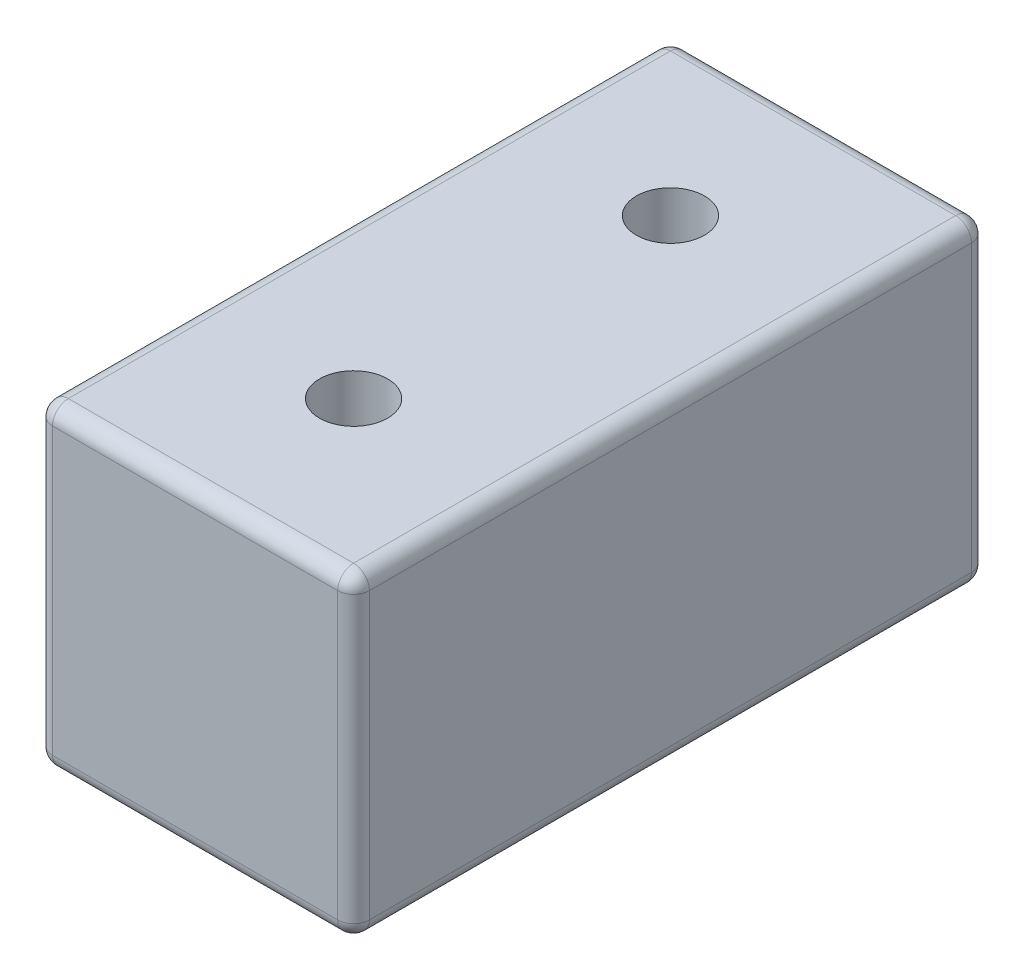
ISO-10303-21;
HEADER;
FILE_DESCRIPTION(('STEP AP214'),'2;1');
FILE_NAME('part.step','',(''),(''),'','','');
FILE_SCHEMA(('AUTOMOTIVE_DESIGN { 1 0 10303 214 1 1 1 1 }'));
ENDSEC;
DATA;
#1=APPLICATION_CONTEXT('core data for automotive mechanical design processes');
#2=APPLICATION_PROTOCOL_DEFINITION('international standard','automotive_design',2000,#1);
#3=PRODUCT_CONTEXT('',#1,'mechanical');
#4=PRODUCT('Part','Part','',(#3));
#5=PRODUCT_RELATED_PRODUCT_CATEGORY('part','',(#4));
#6=PRODUCT_DEFINITION_FORMATION('','',#4);
#7=PRODUCT_DEFINITION_CONTEXT('part definition',#1,'design');
#8=PRODUCT_DEFINITION('design','',#6,#7);
#9=PRODUCT_DEFINITION_SHAPE('','',#8);
#10=(LENGTH_UNIT() NAMED_UNIT(*) SI_UNIT(.MILLI.,.METRE.));
#11=(NAMED_UNIT(*) PLANE_ANGLE_UNIT() SI_UNIT($,.RADIAN.));
#12=(NAMED_UNIT(*) SI_UNIT($,.STERADIAN.) SOLID_ANGLE_UNIT());
#13=UNCERTAINTY_MEASURE_WITH_UNIT(LENGTH_MEASURE(1.E-05),#10,'distance_accuracy_value','');
#14=(GEOMETRIC_REPRESENTATION_CONTEXT(3) GLOBAL_UNCERTAINTY_ASSIGNED_CONTEXT((#13)) GLOBAL_UNIT_ASSIGNED_CONTEXT((#10,
#11,#12)) REPRESENTATION_CONTEXT('',''));
#15=CARTESIAN_POINT('',(0.,0.,0.));
#16=DIRECTION('',(0.,0.,1.));
#17=DIRECTION('',(1.,0.,0.));
#18=AXIS2_PLACEMENT_3D('',#15,#16,#17);
#19=CARTESIAN_POINT('',(0.,0.,40.));
#20=DIRECTION('',(1.,0.,0.));
#21=DIRECTION('',(0.,0.,-1.));
#22=AXIS2_PLACEMENT_3D('',#19,#20,#21);
#23=PLANE('',#22);
#24=DIRECTION('',(0.,-1.,0.));
#25=VECTOR('',#24,1.);
#26=CARTESIAN_POINT('',(0.,0.,39.));
#27=LINE('',#26,#25);
#28=CARTESIAN_POINT('',(0.,1.,39.));
#29=VERTEX_POINT('',#28);
#30=CARTESIAN_POINT('',(0.,19.,39.));
#31=VERTEX_POINT('',#30);
#32=EDGE_CURVE('E167',#29,#31,#27,.F.);
#33=ORIENTED_EDGE('',*,*,#32,.T.);
#34=DIRECTION('',(0.,0.,-1.));
#35=VECTOR('',#34,1.);
#36=CARTESIAN_POINT('',(0.,19.,40.));
#37=LINE('',#36,#35);
#38=CARTESIAN_POINT('',(0.,19.,1.));
#39=VERTEX_POINT('',#38);
#40=EDGE_CURVE('E171',#31,#39,#37,.T.);
#41=ORIENTED_EDGE('',*,*,#40,.T.);
#42=DIRECTION('',(0.,-1.,0.));
#43=VECTOR('',#42,1.);
#44=CARTESIAN_POINT('',(0.,0.,1.));
#45=LINE('',#44,#43);
#46=CARTESIAN_POINT('',(0.,1.,1.));
#47=VERTEX_POINT('',#46);
#48=EDGE_CURVE('E144',#39,#47,#45,.T.);
#49=ORIENTED_EDGE('',*,*,#48,.T.);
#50=DIRECTION('',(0.,0.,-1.));
#51=VECTOR('',#50,1.);
#52=CARTESIAN_POINT('',(0.,1.,40.));
#53=LINE('',#52,#51);
#54=EDGE_CURVE('E162',#47,#29,#53,.F.);
#55=ORIENTED_EDGE('',*,*,#54,.T.);
#56=EDGE_LOOP('',(#33,#41,#49,#55));
#57=FACE_BOUND('',#56,.T.);
#58=ADVANCED_FACE('F47',(#57),#23,.F.);
#59=CARTESIAN_POINT('',(0.,0.,40.));
#60=DIRECTION('',(0.,1.,0.));
#61=DIRECTION('',(0.,0.,1.));
#62=AXIS2_PLACEMENT_3D('',#59,#60,#61);
#63=PLANE('',#62);
#64=DIRECTION('',(1.,0.,0.));
#65=VECTOR('',#64,1.);
#66=CARTESIAN_POINT('',(20.,0.,1.));
#67=LINE('',#66,#65);
#68=CARTESIAN_POINT('',(1.,0.,1.));
#69=VERTEX_POINT('',#68);
#70=CARTESIAN_POINT('',(19.,0.,1.));
#71=VERTEX_POINT('',#70);
#72=EDGE_CURVE('E188',#69,#71,#67,.T.);
#73=ORIENTED_EDGE('',*,*,#72,.T.);
#74=DIRECTION('',(0.,0.,-1.));
#75=VECTOR('',#74,1.);
#76=CARTESIAN_POINT('',(19.,0.,40.));
#77=LINE('',#76,#75);
#78=CARTESIAN_POINT('',(19.,0.,39.));
#79=VERTEX_POINT('',#78);
#80=EDGE_CURVE('E191',#71,#79,#77,.F.);
#81=ORIENTED_EDGE('',*,*,#80,.T.);
#82=DIRECTION('',(1.,0.,0.));
#83=VECTOR('',#82,1.);
#84=CARTESIAN_POINT('',(0.,0.,39.));
#85=LINE('',#84,#83);
#86=CARTESIAN_POINT('',(1.,0.,39.));
#87=VERTEX_POINT('',#86);
#88=EDGE_CURVE('E186',#79,#87,#85,.F.);
#89=ORIENTED_EDGE('',*,*,#88,.T.);
#90=DIRECTION('',(0.,0.,-1.));
#91=VECTOR('',#90,1.);
#92=CARTESIAN_POINT('',(1.,0.,40.));
#93=LINE('',#92,#91);
#94=EDGE_CURVE('E184',#87,#69,#93,.T.);
#95=ORIENTED_EDGE('',*,*,#94,.T.);
#96=EDGE_LOOP('',(#73,#81,#89,#95));
#97=FACE_BOUND('',#96,.T.);
#98=CARTESIAN_POINT('',(10.,0.,30.));
#99=DIRECTION('',(0.,1.,0.));
#100=DIRECTION('',(0.,0.,1.));
#101=AXIS2_PLACEMENT_3D('',#98,#99,#100);
#102=CIRCLE('',#101,2.15);
#103=CARTESIAN_POINT('',(10.,0.,32.15));
#104=VERTEX_POINT('',#103);
#105=EDGE_CURVE('E168',#104,#104,#102,.T.);
#106=ORIENTED_EDGE('',*,*,#105,.T.);
#107=EDGE_LOOP('',(#106));
#108=FACE_BOUND('',#107,.T.);
#109=CARTESIAN_POINT('',(10.,0.,9.99999999999999));
#110=DIRECTION('',(0.,1.,0.));
#111=DIRECTION('',(0.,0.,1.));
#112=AXIS2_PLACEMENT_3D('',#109,#110,#111);
#113=CIRCLE('',#112,2.15);
#114=CARTESIAN_POINT('',(10.,0.,12.15));
#115=VERTEX_POINT('',#114);
#116=EDGE_CURVE('E280',#115,#115,#113,.T.);
#117=ORIENTED_EDGE('',*,*,#116,.T.);
#118=EDGE_LOOP('',(#117));
#119=FACE_BOUND('',#118,.T.);
#120=ADVANCED_FACE('F288',(#97,#108,#119),#63,.F.);
#121=CARTESIAN_POINT('',(20.,0.,40.));
#122=DIRECTION('',(-1.,0.,0.));
#123=DIRECTION('',(0.,0.,1.));
#124=AXIS2_PLACEMENT_3D('',#121,#122,#123);
#125=PLANE('',#124);
#126=DIRECTION('',(0.,1.,0.));
#127=VECTOR('',#126,1.);
#128=CARTESIAN_POINT('',(20.,20.,1.));
#129=LINE('',#128,#127);
#130=CARTESIAN_POINT('',(20.,1.,1.));
#131=VERTEX_POINT('',#130);
#132=CARTESIAN_POINT('',(20.,19.,1.));
#133=VERTEX_POINT('',#132);
#134=EDGE_CURVE('E197',#131,#133,#129,.T.);
#135=ORIENTED_EDGE('',*,*,#134,.T.);
#136=DIRECTION('',(0.,0.,-1.));
#137=VECTOR('',#136,1.);
#138=CARTESIAN_POINT('',(20.,19.,40.));
#139=LINE('',#138,#137);
#140=CARTESIAN_POINT('',(20.,19.,39.));
#141=VERTEX_POINT('',#140);
#142=EDGE_CURVE('E200',#133,#141,#139,.F.);
#143=ORIENTED_EDGE('',*,*,#142,.T.);
#144=DIRECTION('',(0.,1.,0.));
#145=VECTOR('',#144,1.);
#146=CARTESIAN_POINT('',(20.,0.,39.));
#147=LINE('',#146,#145);
#148=CARTESIAN_POINT('',(20.,1.,39.));
#149=VERTEX_POINT('',#148);
#150=EDGE_CURVE('E195',#141,#149,#147,.F.);
#151=ORIENTED_EDGE('',*,*,#150,.T.);
#152=DIRECTION('',(0.,0.,-1.));
#153=VECTOR('',#152,1.);
#154=CARTESIAN_POINT('',(20.,1.,40.));
#155=LINE('',#154,#153);
#156=EDGE_CURVE('E193',#149,#131,#155,.T.);
#157=ORIENTED_EDGE('',*,*,#156,.T.);
#158=EDGE_LOOP('',(#135,#143,#151,#157));
#159=FACE_BOUND('',#158,.T.);
#160=ADVANCED_FACE('F309',(#159),#125,.F.);
#161=CARTESIAN_POINT('',(0.,20.,40.));
#162=DIRECTION('',(0.,-1.,0.));
#163=DIRECTION('',(0.,0.,-1.));
#164=AXIS2_PLACEMENT_3D('',#161,#162,#163);
#165=PLANE('',#164);
#166=DIRECTION('',(0.,0.,-1.));
#167=VECTOR('',#166,1.);
#168=CARTESIAN_POINT('',(19.,20.,40.));
#169=LINE('',#168,#167);
#170=CARTESIAN_POINT('',(19.,20.,39.));
#171=VERTEX_POINT('',#170);
#172=CARTESIAN_POINT('',(19.,20.,1.));
#173=VERTEX_POINT('',#172);
#174=EDGE_CURVE('E204',#171,#173,#169,.T.);
#175=ORIENTED_EDGE('',*,*,#174,.T.);
#176=DIRECTION('',(-1.,0.,0.));
#177=VECTOR('',#176,1.);
#178=CARTESIAN_POINT('',(0.,20.,1.));
#179=LINE('',#178,#177);
#180=CARTESIAN_POINT('',(1.,20.,1.));
#181=VERTEX_POINT('',#180);
#182=EDGE_CURVE('E208',#173,#181,#179,.T.);
#183=ORIENTED_EDGE('',*,*,#182,.T.);
#184=DIRECTION('',(0.,0.,-1.));
#185=VECTOR('',#184,1.);
#186=CARTESIAN_POINT('',(1.,20.,40.));
#187=LINE('',#186,#185);
#188=CARTESIAN_POINT('',(1.,20.,39.));
#189=VERTEX_POINT('',#188);
#190=EDGE_CURVE('E206',#181,#189,#187,.F.);
#191=ORIENTED_EDGE('',*,*,#190,.T.);
#192=DIRECTION('',(-1.,0.,0.));
#193=VECTOR('',#192,1.);
#194=CARTESIAN_POINT('',(0.,20.,39.));
#195=LINE('',#194,#193);
#196=EDGE_CURVE('E202',#189,#171,#195,.F.);
#197=ORIENTED_EDGE('',*,*,#196,.T.);
#198=EDGE_LOOP('',(#175,#183,#191,#197));
#199=FACE_BOUND('',#198,.T.);
#200=CARTESIAN_POINT('',(10.,20.,30.));
#201=DIRECTION('',(0.,1.,0.));
#202=DIRECTION('',(0.,0.,1.));
#203=AXIS2_PLACEMENT_3D('',#200,#201,#202);
#204=CIRCLE('',#203,2.15);
#205=CARTESIAN_POINT('',(10.,20.,32.15));
#206=VERTEX_POINT('',#205);
#207=EDGE_CURVE('E275',#206,#206,#204,.T.);
#208=ORIENTED_EDGE('',*,*,#207,.F.);
#209=EDGE_LOOP('',(#208));
#210=FACE_BOUND('',#209,.T.);
#211=CARTESIAN_POINT('',(10.,20.,9.99999999999999));
#212=DIRECTION('',(0.,1.,0.));
#213=DIRECTION('',(0.,0.,1.));
#214=AXIS2_PLACEMENT_3D('',#211,#212,#213);
#215=CIRCLE('',#214,2.15);
#216=CARTESIAN_POINT('',(10.,20.,12.15));
#217=VERTEX_POINT('',#216);
#218=EDGE_CURVE('E269',#217,#217,#215,.T.);
#219=ORIENTED_EDGE('',*,*,#218,.F.);
#220=EDGE_LOOP('',(#219));
#221=FACE_BOUND('',#220,.T.);
#222=ADVANCED_FACE('F403',(#199,#210,#221),#165,.F.);
#223=CARTESIAN_POINT('',(0.,0.,40.));
#224=DIRECTION('',(0.,0.,-1.));
#225=DIRECTION('',(-1.,0.,0.));
#226=AXIS2_PLACEMENT_3D('',#223,#224,#225);
#227=PLANE('',#226);
#228=DIRECTION('',(-1.,0.,0.));
#229=VECTOR('',#228,1.);
#230=CARTESIAN_POINT('',(0.,19.,40.));
#231=LINE('',#230,#229);
#232=CARTESIAN_POINT('',(19.,19.,40.));
#233=VERTEX_POINT('',#232);
#234=CARTESIAN_POINT('',(1.,19.,40.));
#235=VERTEX_POINT('',#234);
#236=EDGE_CURVE('E211',#233,#235,#231,.T.);
#237=ORIENTED_EDGE('',*,*,#236,.T.);
#238=DIRECTION('',(0.,-1.,0.));
#239=VECTOR('',#238,1.);
#240=CARTESIAN_POINT('',(1.,0.,40.));
#241=LINE('',#240,#239);
#242=CARTESIAN_POINT('',(1.,1.,40.));
#243=VERTEX_POINT('',#242);
#244=EDGE_CURVE('E11',#235,#243,#241,.T.);
#245=ORIENTED_EDGE('',*,*,#244,.T.);
#246=DIRECTION('',(1.,0.,0.));
#247=VECTOR('',#246,1.);
#248=CARTESIAN_POINT('',(0.,1.,40.));
#249=LINE('',#248,#247);
#250=CARTESIAN_POINT('',(19.,1.,40.));
#251=VERTEX_POINT('',#250);
#252=EDGE_CURVE('E56',#243,#251,#249,.T.);
#253=ORIENTED_EDGE('',*,*,#252,.T.);
#254=DIRECTION('',(0.,1.,0.));
#255=VECTOR('',#254,1.);
#256=CARTESIAN_POINT('',(19.,0.,40.));
#257=LINE('',#256,#255);
#258=EDGE_CURVE('E213',#251,#233,#257,.T.);
#259=ORIENTED_EDGE('',*,*,#258,.T.);
#260=EDGE_LOOP('',(#237,#245,#253,#259));
#261=FACE_BOUND('',#260,.T.);
#262=ADVANCED_FACE('F385',(#261),#227,.F.);
#263=CARTESIAN_POINT('',(0.,0.,0.));
#264=DIRECTION('',(0.,0.,-1.));
#265=DIRECTION('',(-1.,0.,0.));
#266=AXIS2_PLACEMENT_3D('',#263,#264,#265);
#267=PLANE('',#266);
#268=DIRECTION('',(1.,0.,0.));
#269=VECTOR('',#268,1.);
#270=CARTESIAN_POINT('',(0.,1.,0.));
#271=LINE('',#270,#269);
#272=CARTESIAN_POINT('',(19.,1.,0.));
#273=VERTEX_POINT('',#272);
#274=CARTESIAN_POINT('',(1.,1.,0.));
#275=VERTEX_POINT('',#274);
#276=EDGE_CURVE('E181',#273,#275,#271,.F.);
#277=ORIENTED_EDGE('',*,*,#276,.T.);
#278=DIRECTION('',(0.,-1.,0.));
#279=VECTOR('',#278,1.);
#280=CARTESIAN_POINT('',(1.,20.,0.));
#281=LINE('',#280,#279);
#282=CARTESIAN_POINT('',(1.,19.,0.));
#283=VERTEX_POINT('',#282);
#284=EDGE_CURVE('E146',#275,#283,#281,.F.);
#285=ORIENTED_EDGE('',*,*,#284,.T.);
#286=DIRECTION('',(-1.,0.,0.));
#287=VECTOR('',#286,1.);
#288=CARTESIAN_POINT('',(20.,19.,0.));
#289=LINE('',#288,#287);
#290=CARTESIAN_POINT('',(19.,19.,0.));
#291=VERTEX_POINT('',#290);
#292=EDGE_CURVE('E174',#283,#291,#289,.F.);
#293=ORIENTED_EDGE('',*,*,#292,.T.);
#294=DIRECTION('',(0.,1.,0.));
#295=VECTOR('',#294,1.);
#296=CARTESIAN_POINT('',(19.,0.,0.));
#297=LINE('',#296,#295);
#298=EDGE_CURVE('E179',#291,#273,#297,.F.);
#299=ORIENTED_EDGE('',*,*,#298,.T.);
#300=EDGE_LOOP('',(#277,#285,#293,#299));
#301=FACE_BOUND('',#300,.T.);
#302=ADVANCED_FACE('F303',(#301),#267,.T.);
#303=CARTESIAN_POINT('',(10.,-20.,9.99999999999999));
#304=DIRECTION('',(0.,1.,0.));
#305=DIRECTION('',(0.,0.,1.));
#306=AXIS2_PLACEMENT_3D('',#303,#304,#305);
#307=CYLINDRICAL_SURFACE('',#306,2.15);
#308=ORIENTED_EDGE('',*,*,#218,.T.);
#309=EDGE_LOOP('',(#308));
#310=FACE_BOUND('',#309,.T.);
#311=ORIENTED_EDGE('',*,*,#116,.F.);
#312=EDGE_LOOP('',(#311));
#313=FACE_BOUND('',#312,.T.);
#314=ADVANCED_FACE('F293',(#310,#313),#307,.F.);
#315=CARTESIAN_POINT('',(10.,-20.,30.));
#316=DIRECTION('',(0.,1.,0.));
#317=DIRECTION('',(0.,0.,1.));
#318=AXIS2_PLACEMENT_3D('',#315,#316,#317);
#319=CYLINDRICAL_SURFACE('',#318,2.15);
#320=ORIENTED_EDGE('',*,*,#207,.T.);
#321=EDGE_LOOP('',(#320));
#322=FACE_BOUND('',#321,.T.);
#323=ORIENTED_EDGE('',*,*,#105,.F.);
#324=EDGE_LOOP('',(#323));
#325=FACE_BOUND('',#324,.T.);
#326=ADVANCED_FACE('F291',(#322,#325),#319,.F.);
#327=CARTESIAN_POINT('',(19.,0.,39.));
#328=DIRECTION('',(0.,1.,0.));
#329=DIRECTION('',(0.,0.,1.));
#330=AXIS2_PLACEMENT_3D('',#327,#328,#329);
#331=CYLINDRICAL_SURFACE('',#330,1.);
#332=CARTESIAN_POINT('',(19.,19.,39.));
#333=DIRECTION('',(0.,1.,0.));
#334=DIRECTION('',(0.,0.,1.));
#335=AXIS2_PLACEMENT_3D('',#332,#333,#334);
#336=CIRCLE('',#335,1.);
#337=EDGE_CURVE('E51',#233,#141,#336,.T.);
#338=ORIENTED_EDGE('',*,*,#337,.F.);
#339=ORIENTED_EDGE('',*,*,#258,.F.);
#340=CARTESIAN_POINT('',(19.,1.,39.));
#341=DIRECTION('',(0.,-1.,0.));
#342=DIRECTION('',(0.,0.,-1.));
#343=AXIS2_PLACEMENT_3D('',#340,#341,#342);
#344=CIRCLE('',#343,1.);
#345=EDGE_CURVE('E262',#149,#251,#344,.T.);
#346=ORIENTED_EDGE('',*,*,#345,.F.);
#347=ORIENTED_EDGE('',*,*,#150,.F.);
#348=EDGE_LOOP('',(#338,#339,#346,#347));
#349=FACE_BOUND('',#348,.T.);
#350=ADVANCED_FACE('F49',(#349),#331,.T.);
#351=CARTESIAN_POINT('',(19.,19.,39.));
#352=DIRECTION('',(1.,0.,0.));
#353=DIRECTION('',(0.,0.,-1.));
#354=AXIS2_PLACEMENT_3D('',#351,#352,#353);
#355=SPHERICAL_SURFACE('',#354,1.);
#356=CARTESIAN_POINT('',(19.,19.,39.));
#357=DIRECTION('',(1.,0.,0.));
#358=DIRECTION('',(0.,0.,-1.));
#359=AXIS2_PLACEMENT_3D('',#356,#357,#358);
#360=CIRCLE('',#359,1.);
#361=EDGE_CURVE('E257',#233,#171,#360,.F.);
#362=ORIENTED_EDGE('',*,*,#361,.F.);
#363=ORIENTED_EDGE('',*,*,#337,.T.);
#364=CARTESIAN_POINT('',(19.,19.,39.));
#365=DIRECTION('',(0.,0.,1.));
#366=DIRECTION('',(1.,0.,0.));
#367=AXIS2_PLACEMENT_3D('',#364,#365,#366);
#368=CIRCLE('',#367,1.);
#369=EDGE_CURVE('E260',#171,#141,#368,.F.);
#370=ORIENTED_EDGE('',*,*,#369,.F.);
#371=EDGE_LOOP('',(#362,#363,#370));
#372=FACE_BOUND('',#371,.T.);
#373=ADVANCED_FACE('F301',(#372),#355,.T.);
#374=CARTESIAN_POINT('',(19.,1.,39.));
#375=DIRECTION('',(0.,0.,1.));
#376=DIRECTION('',(1.,0.,0.));
#377=AXIS2_PLACEMENT_3D('',#374,#375,#376);
#378=SPHERICAL_SURFACE('',#377,1.);
#379=CARTESIAN_POINT('',(19.,1.,39.));
#380=DIRECTION('',(0.,0.,1.));
#381=DIRECTION('',(1.,0.,0.));
#382=AXIS2_PLACEMENT_3D('',#379,#380,#381);
#383=CIRCLE('',#382,1.);
#384=EDGE_CURVE('E251',#149,#79,#383,.F.);
#385=ORIENTED_EDGE('',*,*,#384,.F.);
#386=ORIENTED_EDGE('',*,*,#345,.T.);
#387=CARTESIAN_POINT('',(19.,1.,39.));
#388=DIRECTION('',(1.,0.,0.));
#389=DIRECTION('',(0.,0.,-1.));
#390=AXIS2_PLACEMENT_3D('',#387,#388,#389);
#391=CIRCLE('',#390,1.);
#392=EDGE_CURVE('E254',#79,#251,#391,.F.);
#393=ORIENTED_EDGE('',*,*,#392,.F.);
#394=EDGE_LOOP('',(#385,#386,#393));
#395=FACE_BOUND('',#394,.T.);
#396=ADVANCED_FACE('F374',(#395),#378,.T.);
#397=CARTESIAN_POINT('',(19.,19.,40.));
#398=DIRECTION('',(0.,0.,-1.));
#399=DIRECTION('',(-1.,0.,0.));
#400=AXIS2_PLACEMENT_3D('',#397,#398,#399);
#401=CYLINDRICAL_SURFACE('',#400,1.);
#402=ORIENTED_EDGE('',*,*,#369,.T.);
#403=ORIENTED_EDGE('',*,*,#142,.F.);
#404=CARTESIAN_POINT('',(19.,19.,1.));
#405=DIRECTION('',(0.,0.,-1.));
#406=DIRECTION('',(-1.,0.,0.));
#407=AXIS2_PLACEMENT_3D('',#404,#405,#406);
#408=CIRCLE('',#407,1.);
#409=EDGE_CURVE('E246',#173,#133,#408,.T.);
#410=ORIENTED_EDGE('',*,*,#409,.F.);
#411=ORIENTED_EDGE('',*,*,#174,.F.);
#412=EDGE_LOOP('',(#402,#403,#410,#411));
#413=FACE_BOUND('',#412,.T.);
#414=ADVANCED_FACE('F370',(#413),#401,.T.);
#415=CARTESIAN_POINT('',(0.,19.,39.));
#416=DIRECTION('',(-1.,0.,0.));
#417=DIRECTION('',(0.,0.,1.));
#418=AXIS2_PLACEMENT_3D('',#415,#416,#417);
#419=CYLINDRICAL_SURFACE('',#418,1.);
#420=ORIENTED_EDGE('',*,*,#361,.T.);
#421=ORIENTED_EDGE('',*,*,#196,.F.);
#422=CARTESIAN_POINT('',(1.,19.,39.));
#423=DIRECTION('',(-1.,0.,0.));
#424=DIRECTION('',(0.,0.,1.));
#425=AXIS2_PLACEMENT_3D('',#422,#423,#424);
#426=CIRCLE('',#425,1.);
#427=EDGE_CURVE('E243',#235,#189,#426,.T.);
#428=ORIENTED_EDGE('',*,*,#427,.F.);
#429=ORIENTED_EDGE('',*,*,#236,.F.);
#430=EDGE_LOOP('',(#420,#421,#428,#429));
#431=FACE_BOUND('',#430,.T.);
#432=ADVANCED_FACE('F366',(#431),#419,.T.);
#433=CARTESIAN_POINT('',(1.,0.,39.));
#434=DIRECTION('',(0.,-1.,0.));
#435=DIRECTION('',(0.,0.,-1.));
#436=AXIS2_PLACEMENT_3D('',#433,#434,#435);
#437=CYLINDRICAL_SURFACE('',#436,1.);
#438=CARTESIAN_POINT('',(1.,1.,39.));
#439=DIRECTION('',(0.,-1.,0.));
#440=DIRECTION('',(0.,0.,-1.));
#441=AXIS2_PLACEMENT_3D('',#438,#439,#440);
#442=CIRCLE('',#441,1.);
#443=EDGE_CURVE('E238',#243,#29,#442,.T.);
#444=ORIENTED_EDGE('',*,*,#443,.F.);
#445=ORIENTED_EDGE('',*,*,#244,.F.);
#446=CARTESIAN_POINT('',(1.,19.,39.));
#447=DIRECTION('',(0.,1.,0.));
#448=DIRECTION('',(0.,0.,1.));
#449=AXIS2_PLACEMENT_3D('',#446,#447,#448);
#450=CIRCLE('',#449,1.);
#451=EDGE_CURVE('E240',#31,#235,#450,.T.);
#452=ORIENTED_EDGE('',*,*,#451,.F.);
#453=ORIENTED_EDGE('',*,*,#32,.F.);
#454=EDGE_LOOP('',(#444,#445,#452,#453));
#455=FACE_BOUND('',#454,.T.);
#456=ADVANCED_FACE('F362',(#455),#437,.T.);
#457=CARTESIAN_POINT('',(0.,1.,39.));
#458=DIRECTION('',(1.,0.,0.));
#459=DIRECTION('',(0.,0.,-1.));
#460=AXIS2_PLACEMENT_3D('',#457,#458,#459);
#461=CYLINDRICAL_SURFACE('',#460,1.);
#462=ORIENTED_EDGE('',*,*,#392,.T.);
#463=ORIENTED_EDGE('',*,*,#252,.F.);
#464=CARTESIAN_POINT('',(1.,1.,39.));
#465=DIRECTION('',(-1.,0.,0.));
#466=DIRECTION('',(0.,0.,1.));
#467=AXIS2_PLACEMENT_3D('',#464,#465,#466);
#468=CIRCLE('',#467,1.);
#469=EDGE_CURVE('E64',#87,#243,#468,.T.);
#470=ORIENTED_EDGE('',*,*,#469,.F.);
#471=ORIENTED_EDGE('',*,*,#88,.F.);
#472=EDGE_LOOP('',(#462,#463,#470,#471));
#473=FACE_BOUND('',#472,.T.);
#474=ADVANCED_FACE('F358',(#473),#461,.T.);
#475=CARTESIAN_POINT('',(19.,1.,40.));
#476=DIRECTION('',(0.,0.,-1.));
#477=DIRECTION('',(-1.,0.,0.));
#478=AXIS2_PLACEMENT_3D('',#475,#476,#477);
#479=CYLINDRICAL_SURFACE('',#478,1.);
#480=ORIENTED_EDGE('',*,*,#384,.T.);
#481=ORIENTED_EDGE('',*,*,#80,.F.);
#482=CARTESIAN_POINT('',(19.,1.,1.));
#483=DIRECTION('',(0.,0.,-1.));
#484=DIRECTION('',(-1.,0.,0.));
#485=AXIS2_PLACEMENT_3D('',#482,#483,#484);
#486=CIRCLE('',#485,1.);
#487=EDGE_CURVE('E234',#131,#71,#486,.T.);
#488=ORIENTED_EDGE('',*,*,#487,.F.);
#489=ORIENTED_EDGE('',*,*,#156,.F.);
#490=EDGE_LOOP('',(#480,#481,#488,#489));
#491=FACE_BOUND('',#490,.T.);
#492=ADVANCED_FACE('F354',(#491),#479,.T.);
#493=CARTESIAN_POINT('',(19.,0.,1.));
#494=DIRECTION('',(0.,-1.,0.));
#495=DIRECTION('',(0.,0.,-1.));
#496=AXIS2_PLACEMENT_3D('',#493,#494,#495);
#497=CYLINDRICAL_SURFACE('',#496,1.);
#498=CARTESIAN_POINT('',(19.,19.,1.));
#499=DIRECTION('',(0.,1.,0.));
#500=DIRECTION('',(0.,0.,1.));
#501=AXIS2_PLACEMENT_3D('',#498,#499,#500);
#502=CIRCLE('',#501,1.);
#503=EDGE_CURVE('E248',#133,#291,#502,.T.);
#504=ORIENTED_EDGE('',*,*,#503,.F.);
#505=ORIENTED_EDGE('',*,*,#134,.F.);
#506=CARTESIAN_POINT('',(19.,1.,1.));
#507=DIRECTION('',(0.,-1.,0.));
#508=DIRECTION('',(0.,0.,-1.));
#509=AXIS2_PLACEMENT_3D('',#506,#507,#508);
#510=CIRCLE('',#509,1.);
#511=EDGE_CURVE('E231',#273,#131,#510,.T.);
#512=ORIENTED_EDGE('',*,*,#511,.F.);
#513=ORIENTED_EDGE('',*,*,#298,.F.);
#514=EDGE_LOOP('',(#504,#505,#512,#513));
#515=FACE_BOUND('',#514,.T.);
#516=ADVANCED_FACE('F350',(#515),#497,.T.);
#517=CARTESIAN_POINT('',(19.,19.,1.));
#518=DIRECTION('',(1.,0.,0.));
#519=DIRECTION('',(0.,0.,-1.));
#520=AXIS2_PLACEMENT_3D('',#517,#518,#519);
#521=SPHERICAL_SURFACE('',#520,1.);
#522=ORIENTED_EDGE('',*,*,#409,.T.);
#523=ORIENTED_EDGE('',*,*,#503,.T.);
#524=CARTESIAN_POINT('',(19.,19.,1.));
#525=DIRECTION('',(1.,0.,0.));
#526=DIRECTION('',(0.,0.,-1.));
#527=AXIS2_PLACEMENT_3D('',#524,#525,#526);
#528=CIRCLE('',#527,1.);
#529=EDGE_CURVE('E228',#173,#291,#528,.F.);
#530=ORIENTED_EDGE('',*,*,#529,.F.);
#531=EDGE_LOOP('',(#522,#523,#530));
#532=FACE_BOUND('',#531,.T.);
#533=ADVANCED_FACE('F346',(#532),#521,.T.);
#534=CARTESIAN_POINT('',(1.,19.,39.));
#535=DIRECTION('',(0.,0.,1.));
#536=DIRECTION('',(1.,0.,0.));
#537=AXIS2_PLACEMENT_3D('',#534,#535,#536);
#538=SPHERICAL_SURFACE('',#537,1.);
#539=ORIENTED_EDGE('',*,*,#451,.T.);
#540=ORIENTED_EDGE('',*,*,#427,.T.);
#541=CARTESIAN_POINT('',(1.,19.,39.));
#542=DIRECTION('',(0.,0.,1.));
#543=DIRECTION('',(1.,0.,0.));
#544=AXIS2_PLACEMENT_3D('',#541,#542,#543);
#545=CIRCLE('',#544,1.);
#546=EDGE_CURVE('E225',#31,#189,#545,.F.);
#547=ORIENTED_EDGE('',*,*,#546,.F.);
#548=EDGE_LOOP('',(#539,#540,#547));
#549=FACE_BOUND('',#548,.T.);
#550=ADVANCED_FACE('F343',(#549),#538,.T.);
#551=CARTESIAN_POINT('',(1.,1.,39.));
#552=DIRECTION('',(0.,0.,1.));
#553=DIRECTION('',(1.,0.,0.));
#554=AXIS2_PLACEMENT_3D('',#551,#552,#553);
#555=SPHERICAL_SURFACE('',#554,1.);
#556=ORIENTED_EDGE('',*,*,#469,.T.);
#557=ORIENTED_EDGE('',*,*,#443,.T.);
#558=CARTESIAN_POINT('',(1.,1.,39.));
#559=DIRECTION('',(0.,0.,1.));
#560=DIRECTION('',(1.,0.,0.));
#561=AXIS2_PLACEMENT_3D('',#558,#559,#560);
#562=CIRCLE('',#561,1.);
#563=EDGE_CURVE('E164',#87,#29,#562,.F.);
#564=ORIENTED_EDGE('',*,*,#563,.F.);
#565=EDGE_LOOP('',(#556,#557,#564));
#566=FACE_BOUND('',#565,.T.);
#567=ADVANCED_FACE('F339',(#566),#555,.T.);
#568=CARTESIAN_POINT('',(19.,1.,1.));
#569=DIRECTION('',(1.,0.,0.));
#570=DIRECTION('',(0.,0.,-1.));
#571=AXIS2_PLACEMENT_3D('',#568,#569,#570);
#572=SPHERICAL_SURFACE('',#571,1.);
#573=ORIENTED_EDGE('',*,*,#511,.T.);
#574=ORIENTED_EDGE('',*,*,#487,.T.);
#575=CARTESIAN_POINT('',(19.,1.,1.));
#576=DIRECTION('',(1.,0.,0.));
#577=DIRECTION('',(0.,0.,-1.));
#578=AXIS2_PLACEMENT_3D('',#575,#576,#577);
#579=CIRCLE('',#578,1.);
#580=EDGE_CURVE('E222',#273,#71,#579,.F.);
#581=ORIENTED_EDGE('',*,*,#580,.F.);
#582=EDGE_LOOP('',(#573,#574,#581));
#583=FACE_BOUND('',#582,.T.);
#584=ADVANCED_FACE('F335',(#583),#572,.T.);
#585=CARTESIAN_POINT('',(0.,19.,1.));
#586=DIRECTION('',(1.,0.,0.));
#587=DIRECTION('',(0.,0.,-1.));
#588=AXIS2_PLACEMENT_3D('',#585,#586,#587);
#589=CYLINDRICAL_SURFACE('',#588,1.);
#590=ORIENTED_EDGE('',*,*,#529,.T.);
#591=ORIENTED_EDGE('',*,*,#292,.F.);
#592=CARTESIAN_POINT('',(1.,19.,1.));
#593=DIRECTION('',(-1.,0.,0.));
#594=DIRECTION('',(0.,0.,1.));
#595=AXIS2_PLACEMENT_3D('',#592,#593,#594);
#596=CIRCLE('',#595,1.);
#597=EDGE_CURVE('E219',#181,#283,#596,.T.);
#598=ORIENTED_EDGE('',*,*,#597,.F.);
#599=ORIENTED_EDGE('',*,*,#182,.F.);
#600=EDGE_LOOP('',(#590,#591,#598,#599));
#601=FACE_BOUND('',#600,.T.);
#602=ADVANCED_FACE('F331',(#601),#589,.T.);
#603=CARTESIAN_POINT('',(1.,19.,40.));
#604=DIRECTION('',(0.,0.,-1.));
#605=DIRECTION('',(-1.,0.,0.));
#606=AXIS2_PLACEMENT_3D('',#603,#604,#605);
#607=CYLINDRICAL_SURFACE('',#606,1.);
#608=ORIENTED_EDGE('',*,*,#546,.T.);
#609=ORIENTED_EDGE('',*,*,#190,.F.);
#610=CARTESIAN_POINT('',(1.,19.,1.));
#611=DIRECTION('',(0.,0.,-1.));
#612=DIRECTION('',(-1.,0.,0.));
#613=AXIS2_PLACEMENT_3D('',#610,#611,#612);
#614=CIRCLE('',#613,1.);
#615=EDGE_CURVE('E159',#39,#181,#614,.T.);
#616=ORIENTED_EDGE('',*,*,#615,.F.);
#617=ORIENTED_EDGE('',*,*,#40,.F.);
#618=EDGE_LOOP('',(#608,#609,#616,#617));
#619=FACE_BOUND('',#618,.T.);
#620=ADVANCED_FACE('F328',(#619),#607,.T.);
#621=CARTESIAN_POINT('',(1.,1.,40.));
#622=DIRECTION('',(0.,0.,-1.));
#623=DIRECTION('',(-1.,0.,0.));
#624=AXIS2_PLACEMENT_3D('',#621,#622,#623);
#625=CYLINDRICAL_SURFACE('',#624,1.);
#626=ORIENTED_EDGE('',*,*,#563,.T.);
#627=ORIENTED_EDGE('',*,*,#54,.F.);
#628=CARTESIAN_POINT('',(1.,1.,1.));
#629=DIRECTION('',(0.,0.,-1.));
#630=DIRECTION('',(-1.,0.,0.));
#631=AXIS2_PLACEMENT_3D('',#628,#629,#630);
#632=CIRCLE('',#631,1.);
#633=EDGE_CURVE('E152',#69,#47,#632,.T.);
#634=ORIENTED_EDGE('',*,*,#633,.F.);
#635=ORIENTED_EDGE('',*,*,#94,.F.);
#636=EDGE_LOOP('',(#626,#627,#634,#635));
#637=FACE_BOUND('',#636,.T.);
#638=ADVANCED_FACE('F163',(#637),#625,.T.);
#639=CARTESIAN_POINT('',(0.,1.,1.));
#640=DIRECTION('',(-1.,0.,0.));
#641=DIRECTION('',(0.,0.,1.));
#642=AXIS2_PLACEMENT_3D('',#639,#640,#641);
#643=CYLINDRICAL_SURFACE('',#642,1.);
#644=ORIENTED_EDGE('',*,*,#580,.T.);
#645=ORIENTED_EDGE('',*,*,#72,.F.);
#646=CARTESIAN_POINT('',(1.,1.,1.));
#647=DIRECTION('',(-1.,0.,0.));
#648=DIRECTION('',(0.,0.,1.));
#649=AXIS2_PLACEMENT_3D('',#646,#647,#648);
#650=CIRCLE('',#649,1.);
#651=EDGE_CURVE('E156',#275,#69,#650,.T.);
#652=ORIENTED_EDGE('',*,*,#651,.F.);
#653=ORIENTED_EDGE('',*,*,#276,.F.);
#654=EDGE_LOOP('',(#644,#645,#652,#653));
#655=FACE_BOUND('',#654,.T.);
#656=ADVANCED_FACE('F321',(#655),#643,.T.);
#657=CARTESIAN_POINT('',(1.,19.,1.));
#658=DIRECTION('',(0.,1.,0.));
#659=DIRECTION('',(0.,0.,1.));
#660=AXIS2_PLACEMENT_3D('',#657,#658,#659);
#661=SPHERICAL_SURFACE('',#660,1.);
#662=ORIENTED_EDGE('',*,*,#615,.T.);
#663=ORIENTED_EDGE('',*,*,#597,.T.);
#664=CARTESIAN_POINT('',(1.,19.,1.));
#665=DIRECTION('',(0.,1.,0.));
#666=DIRECTION('',(0.,0.,1.));
#667=AXIS2_PLACEMENT_3D('',#664,#665,#666);
#668=CIRCLE('',#667,1.);
#669=EDGE_CURVE('E149',#39,#283,#668,.F.);
#670=ORIENTED_EDGE('',*,*,#669,.F.);
#671=EDGE_LOOP('',(#662,#663,#670));
#672=FACE_BOUND('',#671,.T.);
#673=ADVANCED_FACE('F318',(#672),#661,.T.);
#674=CARTESIAN_POINT('',(1.,1.,1.));
#675=DIRECTION('',(0.,-1.,0.));
#676=DIRECTION('',(0.,0.,-1.));
#677=AXIS2_PLACEMENT_3D('',#674,#675,#676);
#678=SPHERICAL_SURFACE('',#677,1.);
#679=ORIENTED_EDGE('',*,*,#651,.T.);
#680=ORIENTED_EDGE('',*,*,#633,.T.);
#681=CARTESIAN_POINT('',(1.,1.,1.));
#682=DIRECTION('',(0.,-1.,0.));
#683=DIRECTION('',(0.,0.,-1.));
#684=AXIS2_PLACEMENT_3D('',#681,#682,#683);
#685=CIRCLE('',#684,1.);
#686=EDGE_CURVE('E140',#275,#47,#685,.F.);
#687=ORIENTED_EDGE('',*,*,#686,.F.);
#688=EDGE_LOOP('',(#679,#680,#687));
#689=FACE_BOUND('',#688,.T.);
#690=ADVANCED_FACE('F154',(#689),#678,.T.);
#691=CARTESIAN_POINT('',(1.,0.,1.));
#692=DIRECTION('',(0.,1.,0.));
#693=DIRECTION('',(0.,0.,1.));
#694=AXIS2_PLACEMENT_3D('',#691,#692,#693);
#695=CYLINDRICAL_SURFACE('',#694,1.);
#696=ORIENTED_EDGE('',*,*,#669,.T.);
#697=ORIENTED_EDGE('',*,*,#284,.F.);
#698=ORIENTED_EDGE('',*,*,#686,.T.);
#699=ORIENTED_EDGE('',*,*,#48,.F.);
#700=EDGE_LOOP('',(#696,#697,#698,#699));
#701=FACE_BOUND('',#700,.T.);
#702=ADVANCED_FACE('F142',(#701),#695,.T.);
#703=CLOSED_SHELL('',(#58,#120,#160,#222,#262,#302,#314,#326,#350,#373,#396,#414,#432,#456,#474,
#492,#516,#533,#550,#567,#584,#602,#620,#638,#656,#673,#690,#702));
#704=MANIFOLD_SOLID_BREP('B2',#703);
#705=ADVANCED_BREP_SHAPE_REPRESENTATION('',(#18,#704),#14);
#706=SHAPE_DEFINITION_REPRESENTATION(#9,#705);
ENDSEC;
END-ISO-10303-21;
